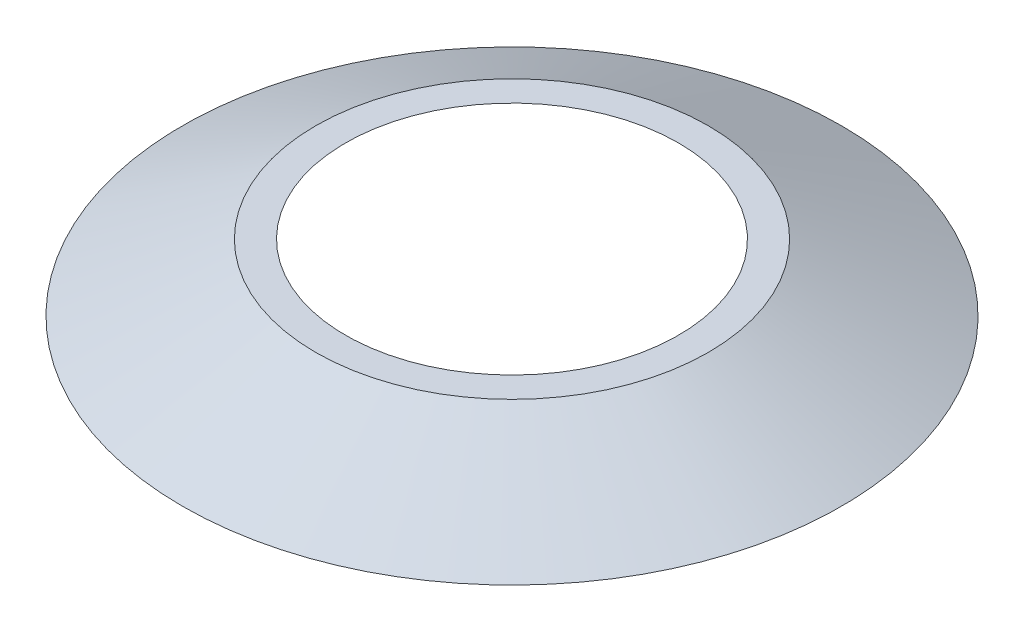
ISO-10303-21;
HEADER;
FILE_DESCRIPTION(('STEP AP214'),'2;1');
FILE_NAME('part.step','',(''),(''),'','','');
FILE_SCHEMA(('AUTOMOTIVE_DESIGN { 1 0 10303 214 1 1 1 1 }'));
ENDSEC;
DATA;
#1=APPLICATION_CONTEXT('core data for automotive mechanical design processes');
#2=APPLICATION_PROTOCOL_DEFINITION('international standard','automotive_design',2000,#1);
#3=PRODUCT_CONTEXT('',#1,'mechanical');
#4=PRODUCT('Part','Part','',(#3));
#5=PRODUCT_RELATED_PRODUCT_CATEGORY('part','',(#4));
#6=PRODUCT_DEFINITION_FORMATION('','',#4);
#7=PRODUCT_DEFINITION_CONTEXT('part definition',#1,'design');
#8=PRODUCT_DEFINITION('design','',#6,#7);
#9=PRODUCT_DEFINITION_SHAPE('','',#8);
#10=(LENGTH_UNIT() NAMED_UNIT(*) SI_UNIT(.MILLI.,.METRE.));
#11=(NAMED_UNIT(*) PLANE_ANGLE_UNIT() SI_UNIT($,.RADIAN.));
#12=(NAMED_UNIT(*) SI_UNIT($,.STERADIAN.) SOLID_ANGLE_UNIT());
#13=UNCERTAINTY_MEASURE_WITH_UNIT(LENGTH_MEASURE(1.E-05),#10,'distance_accuracy_value','');
#14=(GEOMETRIC_REPRESENTATION_CONTEXT(3) GLOBAL_UNCERTAINTY_ASSIGNED_CONTEXT((#13)) GLOBAL_UNIT_ASSIGNED_CONTEXT((#10,
#11,#12)) REPRESENTATION_CONTEXT('',''));
#15=CARTESIAN_POINT('',(0.,0.,0.));
#16=DIRECTION('',(0.,0.,1.));
#17=DIRECTION('',(1.,0.,0.));
#18=AXIS2_PLACEMENT_3D('',#15,#16,#17);
#19=CARTESIAN_POINT('',(-4.94721359549996,0.,0.));
#20=DIRECTION('',(0.,1.,0.));
#21=DIRECTION('',(0.,0.,1.));
#22=AXIS2_PLACEMENT_3D('',#19,#20,#21);
#23=PLANE('',#22);
#24=CARTESIAN_POINT('',(0.,0.,0.));
#25=DIRECTION('',(0.,-1.,0.));
#26=DIRECTION('',(0.,0.,-1.));
#27=AXIS2_PLACEMENT_3D('',#24,#25,#26);
#28=CIRCLE('',#27,4.5);
#29=CARTESIAN_POINT('',(0.,0.,-4.5));
#30=VERTEX_POINT('',#29);
#31=EDGE_CURVE('E10',#30,#30,#28,.T.);
#32=ORIENTED_EDGE('',*,*,#31,.F.);
#33=EDGE_LOOP('',(#32));
#34=FACE_BOUND('',#33,.T.);
#35=CARTESIAN_POINT('',(0.,0.,0.));
#36=DIRECTION('',(0.,-1.,0.));
#37=DIRECTION('',(0.,0.,-1.));
#38=AXIS2_PLACEMENT_3D('',#35,#36,#37);
#39=CIRCLE('',#38,4.94721359549996);
#40=CARTESIAN_POINT('',(0.,0.,-4.94721359549996));
#41=VERTEX_POINT('',#40);
#42=EDGE_CURVE('E51',#41,#41,#39,.T.);
#43=ORIENTED_EDGE('',*,*,#42,.T.);
#44=EDGE_LOOP('',(#43));
#45=FACE_BOUND('',#44,.T.);
#46=ADVANCED_FACE('F35',(#34,#45),#23,.F.);
#47=CARTESIAN_POINT('',(0.,0.,0.));
#48=DIRECTION('',(0.,-1.,0.));
#49=DIRECTION('',(0.,0.,-1.));
#50=AXIS2_PLACEMENT_3D('',#47,#48,#49);
#51=CONICAL_SURFACE('',#50,4.5,1.10714871779409);
#52=CARTESIAN_POINT('',(0.,1.,0.));
#53=DIRECTION('',(0.,-1.,0.));
#54=DIRECTION('',(0.,0.,-1.));
#55=AXIS2_PLACEMENT_3D('',#52,#53,#54);
#56=CIRCLE('',#55,2.5);
#57=CARTESIAN_POINT('',(0.,1.,-2.5));
#58=VERTEX_POINT('',#57);
#59=EDGE_CURVE('E42',#58,#58,#56,.T.);
#60=ORIENTED_EDGE('',*,*,#59,.F.);
#61=EDGE_LOOP('',(#60));
#62=FACE_BOUND('',#61,.T.);
#63=ORIENTED_EDGE('',*,*,#31,.T.);
#64=EDGE_LOOP('',(#63));
#65=FACE_BOUND('',#64,.T.);
#66=ADVANCED_FACE('F66',(#62,#65),#51,.F.);
#67=CARTESIAN_POINT('',(-2.5,1.,0.));
#68=DIRECTION('',(0.,-1.,0.));
#69=DIRECTION('',(0.,0.,-1.));
#70=AXIS2_PLACEMENT_3D('',#67,#68,#69);
#71=PLANE('',#70);
#72=CARTESIAN_POINT('',(0.,1.,0.));
#73=DIRECTION('',(0.,-1.,0.));
#74=DIRECTION('',(0.,0.,-1.));
#75=AXIS2_PLACEMENT_3D('',#72,#73,#74);
#76=CIRCLE('',#75,2.94721359549996);
#77=CARTESIAN_POINT('',(0.,1.,-2.94721359549996));
#78=VERTEX_POINT('',#77);
#79=EDGE_CURVE('E47',#78,#78,#76,.T.);
#80=ORIENTED_EDGE('',*,*,#79,.F.);
#81=EDGE_LOOP('',(#80));
#82=FACE_BOUND('',#81,.T.);
#83=ORIENTED_EDGE('',*,*,#59,.T.);
#84=EDGE_LOOP('',(#83));
#85=FACE_BOUND('',#84,.T.);
#86=ADVANCED_FACE('F61',(#82,#85),#71,.F.);
#87=CARTESIAN_POINT('',(0.,1.,0.));
#88=DIRECTION('',(0.,-1.,0.));
#89=DIRECTION('',(0.,0.,-1.));
#90=AXIS2_PLACEMENT_3D('',#87,#88,#89);
#91=CONICAL_SURFACE('',#90,2.94721359549996,1.10714871779409);
#92=ORIENTED_EDGE('',*,*,#42,.F.);
#93=EDGE_LOOP('',(#92));
#94=FACE_BOUND('',#93,.T.);
#95=ORIENTED_EDGE('',*,*,#79,.T.);
#96=EDGE_LOOP('',(#95));
#97=FACE_BOUND('',#96,.T.);
#98=ADVANCED_FACE('F58',(#94,#97),#91,.T.);
#99=CLOSED_SHELL('',(#46,#66,#86,#98));
#100=MANIFOLD_SOLID_BREP('B2',#99);
#101=ADVANCED_BREP_SHAPE_REPRESENTATION('',(#18,#100),#14);
#102=SHAPE_DEFINITION_REPRESENTATION(#9,#101);
ENDSEC;
END-ISO-10303-21;
